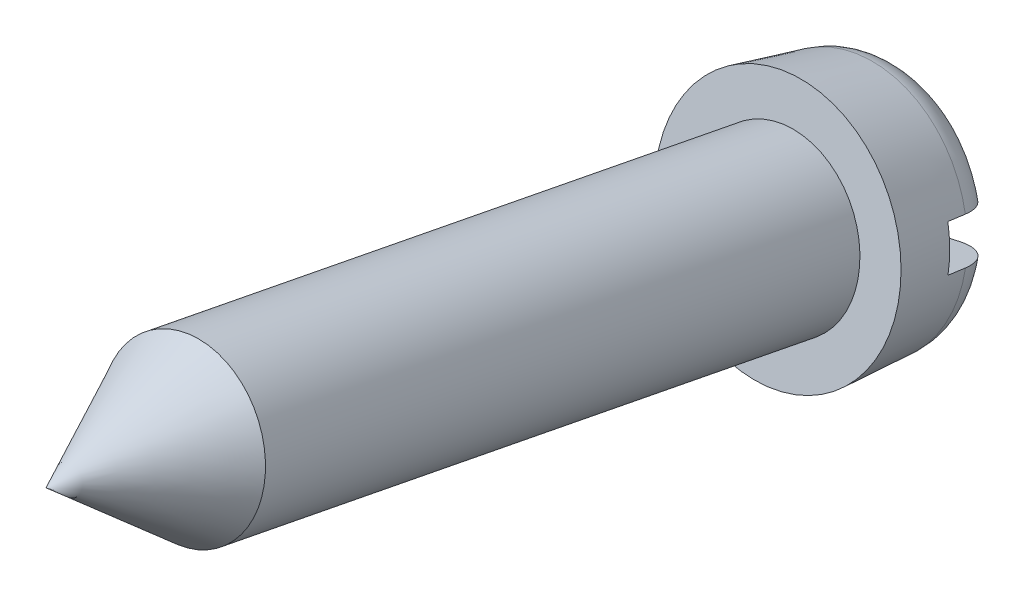
ISO-10303-21;
HEADER;
FILE_DESCRIPTION(('STEP AP214'),'2;1');
FILE_NAME('part.step','',(''),(''),'','','');
FILE_SCHEMA(('AUTOMOTIVE_DESIGN { 1 0 10303 214 1 1 1 1 }'));
ENDSEC;
DATA;
#1=APPLICATION_CONTEXT('core data for automotive mechanical design processes');
#2=APPLICATION_PROTOCOL_DEFINITION('international standard','automotive_design',2000,#1);
#3=PRODUCT_CONTEXT('',#1,'mechanical');
#4=PRODUCT('Part','Part','',(#3));
#5=PRODUCT_RELATED_PRODUCT_CATEGORY('part','',(#4));
#6=PRODUCT_DEFINITION_FORMATION('','',#4);
#7=PRODUCT_DEFINITION_CONTEXT('part definition',#1,'design');
#8=PRODUCT_DEFINITION('design','',#6,#7);
#9=PRODUCT_DEFINITION_SHAPE('','',#8);
#10=(LENGTH_UNIT() NAMED_UNIT(*) SI_UNIT(.MILLI.,.METRE.));
#11=(NAMED_UNIT(*) PLANE_ANGLE_UNIT() SI_UNIT($,.RADIAN.));
#12=(NAMED_UNIT(*) SI_UNIT($,.STERADIAN.) SOLID_ANGLE_UNIT());
#13=UNCERTAINTY_MEASURE_WITH_UNIT(LENGTH_MEASURE(1.E-05),#10,'distance_accuracy_value','');
#14=(GEOMETRIC_REPRESENTATION_CONTEXT(3) GLOBAL_UNCERTAINTY_ASSIGNED_CONTEXT((#13)) GLOBAL_UNIT_ASSIGNED_CONTEXT((#10,
#11,#12)) REPRESENTATION_CONTEXT('',''));
#15=CARTESIAN_POINT('',(0.,0.,0.));
#16=DIRECTION('',(0.,0.,1.));
#17=DIRECTION('',(1.,0.,0.));
#18=AXIS2_PLACEMENT_3D('',#15,#16,#17);
#19=CARTESIAN_POINT('',(-0.38161799075315,-15.0107993042347,-13.7981333496274));
#20=DIRECTION('',(0.,-0.190808995376531,-0.981627183447667));
#21=DIRECTION('',(0.,0.981627183447667,-0.190808995376531));
#22=AXIS2_PLACEMENT_3D('',#19,#20,#21);
#23=PLANE('',#22);
#24=CARTESIAN_POINT('',(0.,-16.9379831588022,-13.4235267562156));
#25=DIRECTION('',(0.,0.19080899537653,0.981627183447667));
#26=DIRECTION('',(0.,-0.981627183447667,0.19080899537653));
#27=AXIS2_PLACEMENT_3D('',#24,#25,#26);
#28=CIRCLE('',#27,2.99999999999838);
#29=CARTESIAN_POINT('',(0.,-19.8828647091437,-12.8510997700863));
#30=VERTEX_POINT('',#29);
#31=EDGE_CURVE('E362',#30,#30,#28,.F.);
#32=ORIENTED_EDGE('',*,*,#31,.F.);
#33=EDGE_LOOP('',(#32));
#34=FACE_BOUND('',#33,.T.);
#35=CARTESIAN_POINT('',(0.,-16.9379831588015,-13.4235267562115));
#36=DIRECTION('',(0.,-0.190808995376531,-0.981627183447667));
#37=DIRECTION('',(0.,0.981627183447667,-0.190808995376531));
#38=AXIS2_PLACEMENT_3D('',#35,#36,#37);
#39=CIRCLE('',#38,2.);
#40=CARTESIAN_POINT('',(0.,-14.9747287919061,-13.8051447469646));
#41=VERTEX_POINT('',#40);
#42=EDGE_CURVE('E368',#41,#41,#39,.F.);
#43=ORIENTED_EDGE('',*,*,#42,.F.);
#44=EDGE_LOOP('',(#43));
#45=FACE_BOUND('',#44,.T.);
#46=ADVANCED_FACE('F50',(#34,#45),#23,.F.);
#47=CARTESIAN_POINT('',(-0.306171576976402,-17.7539955935755,-14.6401775450695));
#48=DIRECTION('',(0.190808995376531,-0.963591927283399,0.187303296707943));
#49=DIRECTION('',(0.980952700432199,0.194246749045578,0.));
#50=AXIS2_PLACEMENT_3D('',#47,#48,#49);
#51=PLANE('',#50);
#52=CARTESIAN_POINT('',(2.38365123055152,-18.32642216919,-20.3252243839958));
#53=CARTESIAN_POINT('',(2.51154049356638,-18.0241711665487,-18.9005607018649));
#54=CARTESIAN_POINT('',(2.63899509345392,-17.7219955620035,-17.475842110728));
#55=CARTESIAN_POINT('',(2.79042943849088,-17.3621896799928,-15.7790700109387));
#56=CARTESIAN_POINT('',(2.81469562274593,-17.3045097003938,-15.5070526072748));
#57=CARTESIAN_POINT('',(2.85311913683512,-17.2131436953948,-15.0761579346152));
#58=CARTESIAN_POINT('',(2.86728297618997,-17.1794565403728,-14.9172814855761));
#59=CARTESIAN_POINT('',(2.88144363574417,-17.1457699371895,-14.7584046361844));
#60=B_SPLINE_CURVE_WITH_KNOTS('',3,(#52,#53,#54,#55,#56,#57,#58,#59),.UNSPECIFIED.,.F.,.F.,(4,2,
2,4),(0.,4.38593202307131,5.22329912253804,5.71237425293923),.UNSPECIFIED.);
#61=CARTESIAN_POINT('',(2.83895192718186,-17.2468314352771,-15.2350339591212));
#62=VERTEX_POINT('',#61);
#63=CARTESIAN_POINT('',(2.88144363574384,-17.1457699371902,-14.758404636188));
#64=VERTEX_POINT('',#63);
#65=EDGE_CURVE('E207',#62,#64,#60,.T.);
#66=ORIENTED_EDGE('',*,*,#65,.F.);
#67=CARTESIAN_POINT('',(2.83895192718186,-17.2468314352771,-15.2350339591212));
#68=CARTESIAN_POINT('',(2.83653356094295,-17.2525819121392,-15.2621539678937));
#69=CARTESIAN_POINT('',(2.8329621881366,-17.2585298886465,-15.2891154372193));
#70=CARTESIAN_POINT('',(2.82354285851075,-17.2707823160517,-15.3425530834871));
#71=CARTESIAN_POINT('',(2.81769507989926,-17.2770867390122,-15.3690292982473));
#72=CARTESIAN_POINT('',(2.79680855282106,-17.2964522256432,-15.4473786364315));
#73=CARTESIAN_POINT('',(2.77841660498609,-17.3099890117484,-15.4982831794404));
#74=CARTESIAN_POINT('',(2.73324661677561,-17.3379190539249,-15.5959553689845));
#75=CARTESIAN_POINT('',(2.70646574862995,-17.3523125974681,-15.6427216137384));
#76=CARTESIAN_POINT('',(2.64531664899881,-17.3815490022671,-15.7308362687842));
#77=CARTESIAN_POINT('',(2.61094926044076,-17.3963918134475,-15.7721852801645));
#78=CARTESIAN_POINT('',(2.53539284080362,-17.4262075178217,-15.8486031957463));
#79=CARTESIAN_POINT('',(2.49416128446664,-17.4411806329746,-15.8836299206384));
#80=CARTESIAN_POINT('',(2.40622084565148,-17.4707536944926,-15.9461837398524));
#81=CARTESIAN_POINT('',(2.35951017758502,-17.4853535173068,-15.973708379552));
#82=CARTESIAN_POINT('',(2.26110951386992,-17.5140309504917,-16.02099858469));
#83=CARTESIAN_POINT('',(2.20934739424114,-17.5280951687179,-16.0406217796147));
#84=CARTESIAN_POINT('',(2.10302016286996,-17.5550550438747,-16.0710009878965));
#85=CARTESIAN_POINT('',(2.04845720351463,-17.5679515776891,-16.0817637051022));
#86=CARTESIAN_POINT('',(1.96735436677044,-17.5858052185493,-16.0909919110895));
#87=CARTESIAN_POINT('',(1.94129464997065,-17.5913464976002,-16.0929518519147));
#88=CARTESIAN_POINT('',(1.88908299050371,-17.6020653974797,-16.0949069221665));
#89=CARTESIAN_POINT('',(1.86293134909708,-17.6072437451039,-16.0949060975313));
#90=CARTESIAN_POINT('',(1.83676947074281,-17.6122357586362,-16.0939362385456));
#91=B_SPLINE_CURVE_WITH_KNOTS('',3,(#67,#68,#69,#70,#71,#72,#73,#74,#75,#76,#77,#78,#79,#80,#81,
#82,#83,#84,#85,#86,#87,#88,#89,#90),.UNSPECIFIED.,.F.,.F.,(4,2,2,2,2,2,2,2,2,2,2,4),(0.,
0.0834330039714536,0.166859477718361,0.333375890255215,0.499948493309031,0.666502598026343,
0.834129813000788,1.00181180859714,1.1723927908766,1.3428445924502,1.42292459800113,
1.50283936274397),.UNSPECIFIED.);
#92=CARTESIAN_POINT('',(1.83676947074281,-17.6122357586362,-16.0939362385456));
#93=VERTEX_POINT('',#92);
#94=EDGE_CURVE('E325',#62,#93,#91,.T.);
#95=ORIENTED_EDGE('',*,*,#94,.T.);
#96=DIRECTION('',(0.981627183447667,0.187303296707943,-0.0364080727166026));
#97=VECTOR('',#96,1.);
#98=CARTESIAN_POINT('',(-1.64596047536363,-18.2767719608205,-15.9647634861318));
#99=LINE('',#98,#97);
#100=CARTESIAN_POINT('',(0.496980572352765,-17.8678795323546,-16.0442441227811));
#101=VERTEX_POINT('',#100);
#102=EDGE_CURVE('E373',#101,#93,#99,.T.);
#103=ORIENTED_EDGE('',*,*,#102,.F.);
#104=DIRECTION('',(0.,-0.190808995376531,-0.981627183447667));
#105=VECTOR('',#104,1.);
#106=CARTESIAN_POINT('',(0.496980572352765,-17.6007469388275,-14.6699660659543));
#107=LINE('',#106,#105);
#108=CARTESIAN_POINT('',(0.496980572352765,-17.6007469388275,-14.6699660659543));
#109=VERTEX_POINT('',#108);
#110=EDGE_CURVE('E445',#109,#101,#107,.T.);
#111=ORIENTED_EDGE('',*,*,#110,.F.);
#112=DIRECTION('',(-0.981627183447667,-0.187303296707942,0.0364080727166006));
#113=VECTOR('',#112,1.);
#114=CARTESIAN_POINT('',(-0.306171576976402,-17.7539955935755,-14.6401775450695));
#115=LINE('',#114,#113);
#116=EDGE_CURVE('E394',#64,#109,#115,.T.);
#117=ORIENTED_EDGE('',*,*,#116,.F.);
#118=EDGE_LOOP('',(#66,#95,#103,#111,#117));
#119=FACE_BOUND('',#118,.T.);
#120=ADVANCED_FACE('F172',(#119),#51,.F.);
#121=CARTESIAN_POINT('',(0.306171576976228,-16.6371550115441,-14.8572693626623));
#122=DIRECTION('',(-0.190808995376531,0.963591927283399,-0.187303296707943));
#123=DIRECTION('',(-0.980952700432199,-0.194246749045578,0.));
#124=AXIS2_PLACEMENT_3D('',#121,#122,#123);
#125=PLANE('',#124);
#126=CARTESIAN_POINT('',(-2.38365123055169,-18.2360663624492,-20.3427877736425));
#127=CARTESIAN_POINT('',(-2.51154049356655,-17.9826202033985,-18.908637390927));
#128=CARTESIAN_POINT('',(-2.6389950934541,-17.7290835671747,-17.4744643420917));
#129=CARTESIAN_POINT('',(-2.79042943849106,-17.427067755648,-15.7664589905366));
#130=CARTESIAN_POINT('',(-2.81469562274611,-17.3786481885276,-15.4926415450324));
#131=CARTESIAN_POINT('',(-2.8531191368353,-17.3019452877729,-15.0588966536369));
#132=CARTESIAN_POINT('',(-2.86728297619015,-17.2736633086669,-14.8989695448322));
#133=CARTESIAN_POINT('',(-2.88144363574434,-17.2453806679304,-14.7390422715495));
#134=B_SPLINE_CURVE_WITH_KNOTS('',3,(#126,#127,#128,#129,#130,#131,#132,#133),.UNSPECIFIED.,.F.,
.F.,(4,2,2,4),(0.,4.38593202307131,5.22329912253804,5.71237425293924),.UNSPECIFIED.);
#135=CARTESIAN_POINT('',(-2.83895192718204,-17.3302265655728,-15.2188235879138));
#136=VERTEX_POINT('',#135);
#137=CARTESIAN_POINT('',(-2.88144363574418,-17.2453806679308,-14.7390422715513));
#138=VERTEX_POINT('',#137);
#139=EDGE_CURVE('E372',#136,#138,#134,.T.);
#140=ORIENTED_EDGE('',*,*,#139,.F.);
#141=CARTESIAN_POINT('',(-2.83895192718204,-17.3302265655728,-15.2188235879138));
#142=CARTESIAN_POINT('',(-2.83653356094313,-17.3350541503699,-15.2461229887311));
#143=CARTESIAN_POINT('',(-2.83296218813678,-17.3396392267626,-15.2733493790024));
#144=CARTESIAN_POINT('',(-2.82354285851093,-17.3482970685217,-15.3274857419392));
#145=CARTESIAN_POINT('',(-2.81769507989944,-17.3523698739582,-15.3543957392037));
#146=CARTESIAN_POINT('',(-2.79680855282124,-17.3637646860917,-15.4342944195606));
#147=CARTESIAN_POINT('',(-2.77841660498627,-17.3702827740182,-15.4865632592914));
#148=CARTESIAN_POINT('',(-2.73324661677579,-17.3809751360514,-15.5875861144305));
#149=CARTESIAN_POINT('',(-2.70646574863013,-17.3851486185022,-15.6363389378189));
#150=CARTESIAN_POINT('',(-2.64531664899899,-17.3910494267637,-15.7289895733336));
#151=CARTESIAN_POINT('',(-2.61094926044094,-17.3927770241751,-15.7728879240207));
#152=CARTESIAN_POINT('',(-2.5353928408038,-17.3937590394989,-15.8549105409937));
#153=CARTESIAN_POINT('',(-2.49416128446682,-17.3929974509669,-15.8929957824523));
#154=CARTESIAN_POINT('',(-2.40622084565166,-17.3890108589183,-15.9620729375011));
#155=CARTESIAN_POINT('',(-2.35951017758521,-17.3857850504382,-15.9930625289223));
#156=CARTESIAN_POINT('',(-2.26110951387011,-17.3769110200474,-16.0476519991587));
#157=CARTESIAN_POINT('',(-2.20934739424132,-17.3712218821837,-16.0711148575467));
#158=CARTESIAN_POINT('',(-2.10302016287014,-17.3576053729423,-16.1093813159715));
#159=CARTESIAN_POINT('',(-2.04845720351481,-17.349679699838,-16.1241914601949));
#160=CARTESIAN_POINT('',(-1.96735436677062,-17.3365830390955,-16.1394357953757));
#161=CARTESIAN_POINT('',(-1.94129464997083,-17.3321794613817,-16.1433288205332));
#162=CARTESIAN_POINT('',(-1.88908299050389,-17.3229734526816,-16.1491569006742));
#163=CARTESIAN_POINT('',(-1.86293134909726,-17.3181718634573,-16.1510959792488));
#164=CARTESIAN_POINT('',(-1.83676947074299,-17.3131800335377,-16.1520667828396));
#165=B_SPLINE_CURVE_WITH_KNOTS('',3,(#141,#142,#143,#144,#145,#146,#147,#148,#149,#150,#151,
#152,#153,#154,#155,#156,#157,#158,#159,#160,#161,#162,#163,#164),.UNSPECIFIED.,.F.,.F.,(4,2,2,
2,2,2,2,2,2,2,2,4),(0.,0.0834330039714527,0.16685947771836,0.333375890255215,0.49994849330903,
0.666502598026341,0.834129813000784,1.00181180859714,1.1723927908766,1.3428445924502,
1.42292459800113,1.50283936274397),.UNSPECIFIED.);
#166=CARTESIAN_POINT('',(-1.83676947074299,-17.3131800335377,-16.1520667828396));
#167=VERTEX_POINT('',#166);
#168=EDGE_CURVE('E77',#136,#167,#165,.T.);
#169=ORIENTED_EDGE('',*,*,#168,.T.);
#170=DIRECTION('',(-0.981627183447666,-0.187303296707943,0.0364080727166027));
#171=VECTOR('',#170,1.);
#172=CARTESIAN_POINT('',(1.64596047536345,-16.6486438313533,-16.2812395352534));
#173=LINE('',#172,#171);
#174=CARTESIAN_POINT('',(-0.49698057235293,-17.0575362598192,-16.2017588986041));
#175=VERTEX_POINT('',#174);
#176=EDGE_CURVE('E369',#175,#167,#173,.T.);
#177=ORIENTED_EDGE('',*,*,#176,.F.);
#178=DIRECTION('',(0.,-0.190808995376531,-0.981627183447667));
#179=VECTOR('',#178,1.);
#180=CARTESIAN_POINT('',(-0.49698057235293,-16.7904036662921,-14.8274808417774));
#181=LINE('',#180,#179);
#182=CARTESIAN_POINT('',(-0.49698057235293,-16.7904036662921,-14.8274808417774));
#183=VERTEX_POINT('',#182);
#184=EDGE_CURVE('E408',#183,#175,#181,.T.);
#185=ORIENTED_EDGE('',*,*,#184,.F.);
#186=DIRECTION('',(0.981627183447667,0.187303296707943,-0.0364080727166028));
#187=VECTOR('',#186,1.);
#188=CARTESIAN_POINT('',(0.306171576976228,-16.6371550115441,-14.8572693626623));
#189=LINE('',#188,#187);
#190=EDGE_CURVE('E485',#138,#183,#189,.T.);
#191=ORIENTED_EDGE('',*,*,#190,.F.);
#192=EDGE_LOOP('',(#140,#169,#177,#185,#191));
#193=FACE_BOUND('',#192,.T.);
#194=ADVANCED_FACE('F178',(#193),#125,.F.);
#195=CARTESIAN_POINT('',(2.84947705265465,-16.1518694487942,-14.9515993203696));
#196=DIRECTION('',(0.,-0.190808995376531,-0.981627183447667));
#197=DIRECTION('',(0.,0.981627183447667,-0.190808995376531));
#198=AXIS2_PLACEMENT_3D('',#195,#196,#197);
#199=PLANE('',#198);
#200=CARTESIAN_POINT('',(0.,-17.1955753025607,-14.7487234538705));
#201=DIRECTION('',(0.,0.19080899537653,0.981627183447667));
#202=DIRECTION('',(0.,-0.981627183447667,0.19080899537653));
#203=AXIS2_PLACEMENT_3D('',#200,#201,#202);
#204=CIRCLE('',#203,2.88189030424129);
#205=CARTESIAN_POINT('',(2.69063464036752,-16.1821780099064,-14.9457079328936));
#206=VERTEX_POINT('',#205);
#207=EDGE_CURVE('E424',#206,#64,#204,.F.);
#208=ORIENTED_EDGE('',*,*,#207,.T.);
#209=ORIENTED_EDGE('',*,*,#116,.T.);
#210=DIRECTION('',(0.190808995376523,-0.9635919272834,0.187303296707946));
#211=VECTOR('',#210,1.);
#212=CARTESIAN_POINT('',(0.496980572352765,-17.6007469388275,-14.6699660659543));
#213=LINE('',#212,#211);
#214=CARTESIAN_POINT('',(0.623654078814082,-18.2404524620705,-14.5456199085893));
#215=VERTEX_POINT('',#214);
#216=EDGE_CURVE('E695',#109,#215,#213,.T.);
#217=ORIENTED_EDGE('',*,*,#216,.T.);
#218=DIRECTION('',(-0.981627183447668,-0.187303296707938,0.0364080727165954));
#219=VECTOR('',#218,1.);
#220=CARTESIAN_POINT('',(0.623654078814082,-18.2404524620705,-14.5456199085893));
#221=LINE('',#220,#219);
#222=CARTESIAN_POINT('',(-0.179498070515077,-18.3937011168185,-14.5158313877044));
#223=VERTEX_POINT('',#222);
#224=EDGE_CURVE('E696',#215,#223,#221,.T.);
#225=ORIENTED_EDGE('',*,*,#224,.T.);
#226=DIRECTION('',(-0.190808995376522,0.963591927283401,-0.18730329670794));
#227=VECTOR('',#226,1.);
#228=CARTESIAN_POINT('',(-0.179498070515077,-18.3937011168185,-14.5158313877044));
#229=LINE('',#228,#227);
#230=CARTESIAN_POINT('',(-0.306171576976393,-17.7539955935755,-14.6401775450695));
#231=VERTEX_POINT('',#230);
#232=EDGE_CURVE('E435',#223,#231,#229,.T.);
#233=ORIENTED_EDGE('',*,*,#232,.T.);
#234=CARTESIAN_POINT('',(-2.69063464036765,-18.2089725952142,-14.5517389748434));
#235=VERTEX_POINT('',#234);
#236=EDGE_CURVE('E307',#231,#235,#115,.T.);
#237=ORIENTED_EDGE('',*,*,#236,.T.);
#238=EDGE_CURVE('E416',#235,#138,#204,.F.);
#239=ORIENTED_EDGE('',*,*,#238,.T.);
#240=ORIENTED_EDGE('',*,*,#190,.T.);
#241=DIRECTION('',(0.190808995376531,-0.963591927283399,0.187303296707943));
#242=VECTOR('',#241,1.);
#243=CARTESIAN_POINT('',(-0.623654078814252,-16.1506981430491,-14.9518269991425));
#244=LINE('',#243,#242);
#245=CARTESIAN_POINT('',(-0.623654078814252,-16.1506981430491,-14.9518269991425));
#246=VERTEX_POINT('',#245);
#247=EDGE_CURVE('E402',#246,#183,#244,.T.);
#248=ORIENTED_EDGE('',*,*,#247,.F.);
#249=DIRECTION('',(-0.981627183447667,-0.187303296707942,0.0364080727165996));
#250=VECTOR('',#249,1.);
#251=CARTESIAN_POINT('',(0.179498070514904,-15.9974494883011,-14.9816155200273));
#252=LINE('',#251,#250);
#253=CARTESIAN_POINT('',(0.179498070514904,-15.9974494883011,-14.9816155200273));
#254=VERTEX_POINT('',#253);
#255=EDGE_CURVE('E467',#254,#246,#252,.T.);
#256=ORIENTED_EDGE('',*,*,#255,.F.);
#257=DIRECTION('',(0.190808995376531,-0.963591927283399,0.187303296707943));
#258=VECTOR('',#257,1.);
#259=CARTESIAN_POINT('',(0.179498070514904,-15.9974494883011,-14.9816155200273));
#260=LINE('',#259,#258);
#261=CARTESIAN_POINT('',(0.306171576976227,-16.6371550115441,-14.8572693626623));
#262=VERTEX_POINT('',#261);
#263=EDGE_CURVE('E405',#254,#262,#260,.T.);
#264=ORIENTED_EDGE('',*,*,#263,.T.);
#265=EDGE_CURVE('E483',#262,#206,#189,.T.);
#266=ORIENTED_EDGE('',*,*,#265,.T.);
#267=EDGE_LOOP('',(#208,#209,#217,#225,#233,#237,#239,#240,#248,#256,#264,#266));
#268=FACE_BOUND('',#267,.T.);
#269=ADVANCED_FACE('F192',(#268),#199,.T.);
#270=CARTESIAN_POINT('',(0.,-16.9379831588049,-13.423526756229));
#271=DIRECTION('',(0.,0.19080899537653,0.981627183447667));
#272=DIRECTION('',(0.,-0.981627183447667,0.19080899537653));
#273=AXIS2_PLACEMENT_3D('',#270,#271,#272);
#274=CONICAL_SURFACE('',#273,2.99999999999718,0.0872664625975362);
#275=CARTESIAN_POINT('',(-2.69063464036781,-18.2089725952138,-14.5517389748416));
#276=CARTESIAN_POINT('',(-2.67647393490942,-18.2372552263539,-14.7116662455182));
#277=CARTESIAN_POINT('',(-2.66231009948414,-18.2655372062827,-14.8715933545526));
#278=CARTESIAN_POINT('',(-2.57249059449448,-18.4448398882392,-15.885526316352));
#279=CARTESIAN_POINT('',(-2.49674323682555,-18.5958415123657,-16.7395274260264));
#280=CARTESIAN_POINT('',(-2.34499687291621,-18.8977923895074,-18.4475165779647));
#281=CARTESIAN_POINT('',(-2.26899786666589,-19.0487416425205,-19.301504620228));
#282=CARTESIAN_POINT('',(-2.19284223517516,-19.1996582897326,-20.1554844769345));
#283=B_SPLINE_CURVE_WITH_KNOTS('',3,(#275,#276,#277,#278,#279,#280,#281,#282),.UNSPECIFIED.,.F.,
.F.,(4,2,2,4),(0.,0.489075130401186,3.10072465516532,5.71237428273171),.UNSPECIFIED.);
#284=CARTESIAN_POINT('',(-2.6481429318055,-18.2938184928562,-15.0315202912058));
#285=VERTEX_POINT('',#284);
#286=EDGE_CURVE('E215',#235,#285,#283,.T.);
#287=ORIENTED_EDGE('',*,*,#286,.T.);
#288=CARTESIAN_POINT('',(0.,-17.2885290004249,-15.2269287735175));
#289=DIRECTION('',(0.,-0.190808995376531,-0.981627183447667));
#290=DIRECTION('',(0.,0.981627183447667,-0.190808995376531));
#291=AXIS2_PLACEMENT_3D('',#288,#289,#290);
#292=CIRCLE('',#291,2.839269699381);
#293=EDGE_CURVE('E332',#285,#62,#292,.F.);
#294=ORIENTED_EDGE('',*,*,#293,.T.);
#295=ORIENTED_EDGE('',*,*,#65,.T.);
#296=ORIENTED_EDGE('',*,*,#207,.F.);
#297=CARTESIAN_POINT('',(2.69063464036764,-16.1821780099061,-14.9457079328923));
#298=CARTESIAN_POINT('',(2.67647393490925,-16.2158646210109,-15.1045847762728));
#299=CARTESIAN_POINT('',(2.66231009948397,-16.249551775356,-15.2634612258332));
#300=CARTESIAN_POINT('',(2.57249059449427,-16.4631311963372,-16.2707314645051));
#301=CARTESIAN_POINT('',(2.49674323682533,-16.6430393749022,-17.1191137091919));
#302=CARTESIAN_POINT('',(2.34499687291594,-17.0028993945432,-18.8158464641098));
#303=CARTESIAN_POINT('',(2.26899786666561,-17.1828512356208,-19.6641969743396));
#304=CARTESIAN_POINT('',(2.19284223517485,-17.362830241907,-20.5125276807053));
#305=B_SPLINE_CURVE_WITH_KNOTS('',3,(#297,#298,#299,#300,#301,#302,#303,#304),.UNSPECIFIED.,.F.,
.F.,(4,2,2,4),(0.,0.489075130401216,3.10072465516615,5.71237428273335),.UNSPECIFIED.);
#306=CARTESIAN_POINT('',(2.64814293180533,-16.2832395079937,-15.4223372558292));
#307=VERTEX_POINT('',#306);
#308=EDGE_CURVE('E355',#206,#307,#305,.T.);
#309=ORIENTED_EDGE('',*,*,#308,.T.);
#310=CARTESIAN_POINT('',(0.,-17.2885290004249,-15.2269287735175));
#311=DIRECTION('',(0.,-0.190808995376531,-0.981627183447667));
#312=DIRECTION('',(0.,0.981627183447667,-0.190808995376531));
#313=AXIS2_PLACEMENT_3D('',#310,#311,#312);
#314=CIRCLE('',#313,2.839269699381);
#315=EDGE_CURVE('E378',#307,#136,#314,.F.);
#316=ORIENTED_EDGE('',*,*,#315,.T.);
#317=ORIENTED_EDGE('',*,*,#139,.T.);
#318=ORIENTED_EDGE('',*,*,#238,.F.);
#319=EDGE_LOOP('',(#287,#294,#295,#296,#309,#316,#317,#318));
#320=FACE_BOUND('',#319,.T.);
#321=ORIENTED_EDGE('',*,*,#31,.T.);
#322=EDGE_LOOP('',(#321));
#323=FACE_BOUND('',#322,.T.);
#324=ADVANCED_FACE('F187',(#320,#323),#274,.T.);
#325=CARTESIAN_POINT('',(0.,-17.4627078960869,-16.1230015106926));
#326=DIRECTION('',(0.,-0.190808995376531,-0.981627183447667));
#327=DIRECTION('',(0.,0.981627183447667,-0.190808995376531));
#328=AXIS2_PLACEMENT_3D('',#325,#326,#327);
#329=PLANE('',#328);
#330=ORIENTED_EDGE('',*,*,#176,.T.);
#331=CARTESIAN_POINT('',(0.,-17.4627078960869,-16.1230015106926));
#332=DIRECTION('',(0.,-0.190808995376531,-0.981627183447667));
#333=DIRECTION('',(0.,0.981627183447667,-0.190808995376531));
#334=AXIS2_PLACEMENT_3D('',#331,#332,#333);
#335=CIRCLE('',#334,1.84307500128906);
#336=CARTESIAN_POINT('',(1.64596047536628,-16.6486438313528,-16.2812395352535));
#337=VERTEX_POINT('',#336);
#338=EDGE_CURVE('E63',#167,#337,#335,.T.);
#339=ORIENTED_EDGE('',*,*,#338,.T.);
#340=CARTESIAN_POINT('',(0.306171576976227,-16.9042876050712,-16.231547419489));
#341=VERTEX_POINT('',#340);
#342=EDGE_CURVE('E346',#337,#341,#173,.T.);
#343=ORIENTED_EDGE('',*,*,#342,.T.);
#344=DIRECTION('',(0.190808995376531,-0.963591927283399,0.187303296707943));
#345=VECTOR('',#344,1.);
#346=CARTESIAN_POINT('',(0.179498070514905,-16.2645820818282,-16.3558935768541));
#347=LINE('',#346,#345);
#348=CARTESIAN_POINT('',(0.179498070514905,-16.2645820818282,-16.3558935768541));
#349=VERTEX_POINT('',#348);
#350=EDGE_CURVE('E412',#349,#341,#347,.T.);
#351=ORIENTED_EDGE('',*,*,#350,.F.);
#352=DIRECTION('',(0.981627183447667,0.187303296707942,-0.0364080727166038));
#353=VECTOR('',#352,1.);
#354=CARTESIAN_POINT('',(-0.623654078814252,-16.4178307365762,-16.3261050559692));
#355=LINE('',#354,#353);
#356=CARTESIAN_POINT('',(-0.623654078814252,-16.4178307365762,-16.3261050559692));
#357=VERTEX_POINT('',#356);
#358=EDGE_CURVE('E461',#357,#349,#355,.T.);
#359=ORIENTED_EDGE('',*,*,#358,.F.);
#360=DIRECTION('',(0.190808995376531,-0.963591927283399,0.187303296707943));
#361=VECTOR('',#360,1.);
#362=CARTESIAN_POINT('',(-0.623654078814252,-16.4178307365762,-16.3261050559692));
#363=LINE('',#362,#361);
#364=EDGE_CURVE('E396',#357,#175,#363,.T.);
#365=ORIENTED_EDGE('',*,*,#364,.T.);
#366=EDGE_LOOP('',(#330,#339,#343,#351,#359,#365));
#367=FACE_BOUND('',#366,.T.);
#368=ADVANCED_FACE('F191',(#367),#329,.T.);
#369=ORIENTED_EDGE('',*,*,#342,.F.);
#370=CARTESIAN_POINT('',(1.64596047536628,-16.6486438313528,-16.2812395352535));
#371=CARTESIAN_POINT('',(1.67496391385831,-16.6431096850582,-16.2823151077118));
#372=CARTESIAN_POINT('',(1.70395534259786,-16.637346248928,-16.2821988516901));
#373=CARTESIAN_POINT('',(1.76174365594348,-16.6253906377916,-16.2795624839832));
#374=CARTESIAN_POINT('',(1.7905405127658,-16.6191984029184,-16.2770420360058));
#375=CARTESIAN_POINT('',(1.87634962199868,-16.6000305109043,-16.2658469523216));
#376=CARTESIAN_POINT('',(1.93280251408765,-16.5864594531742,-16.2535394164244));
#377=CARTESIAN_POINT('',(2.04249453075154,-16.5581006696657,-16.2193912115166));
#378=CARTESIAN_POINT('',(2.09572901678209,-16.5433112571485,-16.1975371396243));
#379=CARTESIAN_POINT('',(2.1972555643546,-16.5129590300967,-16.1448152570443));
#380=CARTESIAN_POINT('',(2.24555124326469,-16.4973967942,-16.1139541082648));
#381=CARTESIAN_POINT('',(2.33447242119084,-16.4663846096353,-16.0449957381066));
#382=CARTESIAN_POINT('',(2.37526958950736,-16.4509429427688,-16.0071160052863));
#383=CARTESIAN_POINT('',(2.44951276004332,-16.4202084939313,-15.9246337304023));
#384=CARTESIAN_POINT('',(2.48295553538855,-16.4049157801176,-15.8800282517063));
#385=CARTESIAN_POINT('',(2.54077667724319,-16.3752728337738,-15.7864318755772));
#386=CARTESIAN_POINT('',(2.56533335471003,-16.3609094489021,-15.7375549635607));
#387=CARTESIAN_POINT('',(2.60558540205975,-16.3332104820387,-15.6360615649866));
#388=CARTESIAN_POINT('',(2.62129540932469,-16.3198732340009,-15.5834514187102));
#389=CARTESIAN_POINT('',(2.63600172707662,-16.3030859586081,-15.5120699450863));
#390=CARTESIAN_POINT('',(2.63914530574609,-16.2989961645799,-15.4942321948664));
#391=CARTESIAN_POINT('',(2.64440899742294,-16.2909886364609,-15.4583992445121));
#392=CARTESIAN_POINT('',(2.64653077307377,-16.2870706323483,-15.4404043489988));
#393=CARTESIAN_POINT('',(2.64814293180534,-16.2832395079937,-15.4223372558291));
#394=B_SPLINE_CURVE_WITH_KNOTS('',3,(#370,#371,#372,#373,#374,#375,#376,#377,#378,#379,#380,
#381,#382,#383,#384,#385,#386,#387,#388,#389,#390,#391,#392,#393),.UNSPECIFIED.,.F.,.F.,(4,2,2,
2,2,2,2,2,2,2,2,4),(0.,0.0885883998161771,0.177189192969709,0.354324076872299,0.531708453026731,
0.708961961353032,0.881437255332222,1.05398807566973,1.22285426266529,1.39144022257563,
1.44712469884955,1.50271825847926),.UNSPECIFIED.);
#395=EDGE_CURVE('E13',#337,#307,#394,.T.);
#396=ORIENTED_EDGE('',*,*,#395,.T.);
#397=ORIENTED_EDGE('',*,*,#308,.F.);
#398=ORIENTED_EDGE('',*,*,#265,.F.);
#399=DIRECTION('',(0.,0.190808995376531,0.981627183447667));
#400=VECTOR('',#399,1.);
#401=CARTESIAN_POINT('',(0.306171576976228,-16.9042876050712,-16.231547419489));
#402=LINE('',#401,#400);
#403=EDGE_CURVE('E447',#341,#262,#402,.T.);
#404=ORIENTED_EDGE('',*,*,#403,.F.);
#405=EDGE_LOOP('',(#369,#396,#397,#398,#404));
#406=FACE_BOUND('',#405,.T.);
#407=ADVANCED_FACE('F315',(#406),#125,.F.);
#408=CARTESIAN_POINT('',(-1.64596047536646,-18.2767719608211,-15.9647634861317));
#409=VERTEX_POINT('',#408);
#410=CARTESIAN_POINT('',(-0.306171576976393,-18.0211281871026,-16.0144556018962));
#411=VERTEX_POINT('',#410);
#412=EDGE_CURVE('E308',#409,#411,#99,.T.);
#413=ORIENTED_EDGE('',*,*,#412,.F.);
#414=CARTESIAN_POINT('',(-1.64596047536646,-18.276771960821,-15.9647634861317));
#415=CARTESIAN_POINT('',(-1.67496391385849,-18.2823060484487,-15.9636876118585));
#416=CARTESIAN_POINT('',(-1.70395534259804,-18.2876062631032,-15.9614207999771));
#417=CARTESIAN_POINT('',(-1.76174365594366,-18.2977037119947,-15.9544977516446));
#418=CARTESIAN_POINT('',(-1.79054051276598,-18.3025008757621,-15.9498411809622));
#419=CARTESIAN_POINT('',(-1.87634962199886,-18.3160792836018,-15.9322808613893));
#420=CARTESIAN_POINT('',(-1.93280251408783,-18.3240516651228,-15.9157857051106));
#421=CARTESIAN_POINT('',(-2.04249453075172,-18.3375533286152,-15.8735006535741));
#422=CARTESIAN_POINT('',(-2.09572901678227,-18.3430791536958,-15.8476976995173));
#423=CARTESIAN_POINT('',(-2.19725556435477,-18.3514712837367,-15.7874446768283));
#424=CARTESIAN_POINT('',(-2.24555124326487,-18.3543395477878,-15.7530010017714));
#425=CARTESIAN_POINT('',(-2.33447242119102,-18.3572612844786,-15.6774465455093));
#426=CARTESIAN_POINT('',(-2.37526958950754,-18.3573885510135,-15.6365405186015));
#427=CARTESIAN_POINT('',(-2.4495127600435,-18.3549866317431,-15.5485509578615));
#428=CARTESIAN_POINT('',(-2.48295553538873,-18.3524562826618,-15.5014647267636));
#429=CARTESIAN_POINT('',(-2.54077667724336,-18.3448789242956,-15.4035792348221));
#430=CARTESIAN_POINT('',(-2.5653333547102,-18.3398868093384,-15.3528807324626));
#431=CARTESIAN_POINT('',(-2.60558540205993,-18.3275487479083,-15.2484014763417));
#432=CARTESIAN_POINT('',(-2.62129540932487,-18.3202067212776,-15.1946259770749));
#433=CARTESIAN_POINT('',(-2.6360017270768,-18.3090316413167,-15.1221536031679));
#434=CARTESIAN_POINT('',(-2.63914530574627,-18.3061414934641,-15.1040826653536));
#435=CARTESIAN_POINT('',(-2.64440899742312,-18.3001426847868,-15.0678592594933));
#436=CARTESIAN_POINT('',(-2.64653077307395,-18.2970343884349,-15.0497069727351));
#437=CARTESIAN_POINT('',(-2.64814293180551,-18.2938184928562,-15.0315202912058));
#438=B_SPLINE_CURVE_WITH_KNOTS('',3,(#414,#415,#416,#417,#418,#419,#420,#421,#422,#423,#424,
#425,#426,#427,#428,#429,#430,#431,#432,#433,#434,#435,#436,#437),.UNSPECIFIED.,.F.,.F.,(4,2,2,
2,2,2,2,2,2,2,2,4),(0.,0.0885883998161771,0.177189192969709,0.354324076872299,0.53170845302673,
0.708961961353032,0.881437255332222,1.05398807566973,1.22285426266528,1.39144022257563,
1.44712469884955,1.50271825847926),.UNSPECIFIED.);
#439=EDGE_CURVE('E337',#409,#285,#438,.T.);
#440=ORIENTED_EDGE('',*,*,#439,.T.);
#441=ORIENTED_EDGE('',*,*,#286,.F.);
#442=ORIENTED_EDGE('',*,*,#236,.F.);
#443=DIRECTION('',(0.,-0.190808995376531,-0.981627183447667));
#444=VECTOR('',#443,1.);
#445=CARTESIAN_POINT('',(-0.306171576976393,-17.7539955935755,-14.6401775450695));
#446=LINE('',#445,#444);
#447=EDGE_CURVE('E448',#231,#411,#446,.T.);
#448=ORIENTED_EDGE('',*,*,#447,.T.);
#449=EDGE_LOOP('',(#413,#440,#441,#442,#448));
#450=FACE_BOUND('',#449,.T.);
#451=ADVANCED_FACE('F181',(#450),#51,.F.);
#452=CARTESIAN_POINT('',(0.,-17.4627078960869,-16.1230015106926));
#453=DIRECTION('',(0.,-0.190808995376531,-0.981627183447667));
#454=DIRECTION('',(0.,0.981627183447667,-0.190808995376531));
#455=AXIS2_PLACEMENT_3D('',#452,#453,#454);
#456=PLANE('',#455);
#457=ORIENTED_EDGE('',*,*,#102,.T.);
#458=CARTESIAN_POINT('',(0.,-17.4627078960869,-16.1230015106926));
#459=DIRECTION('',(0.,-0.190808995376531,-0.981627183447667));
#460=DIRECTION('',(0.,0.981627183447667,-0.190808995376531));
#461=AXIS2_PLACEMENT_3D('',#458,#459,#460);
#462=CIRCLE('',#461,1.84307500128906);
#463=EDGE_CURVE('E331',#93,#409,#462,.T.);
#464=ORIENTED_EDGE('',*,*,#463,.T.);
#465=ORIENTED_EDGE('',*,*,#412,.T.);
#466=DIRECTION('',(-0.190808995376522,0.963591927283401,-0.18730329670794));
#467=VECTOR('',#466,1.);
#468=CARTESIAN_POINT('',(-0.179498070515077,-18.6608337103456,-15.8901094445311));
#469=LINE('',#468,#467);
#470=CARTESIAN_POINT('',(-0.179498070515077,-18.6608337103456,-15.8901094445311));
#471=VERTEX_POINT('',#470);
#472=EDGE_CURVE('E454',#471,#411,#469,.T.);
#473=ORIENTED_EDGE('',*,*,#472,.F.);
#474=DIRECTION('',(-0.981627183447668,-0.187303296707938,0.0364080727165954));
#475=VECTOR('',#474,1.);
#476=CARTESIAN_POINT('',(0.623654078814082,-18.5075850555976,-15.919897965416));
#477=LINE('',#476,#475);
#478=CARTESIAN_POINT('',(0.623654078814082,-18.5075850555976,-15.919897965416));
#479=VERTEX_POINT('',#478);
#480=EDGE_CURVE('E693',#479,#471,#477,.T.);
#481=ORIENTED_EDGE('',*,*,#480,.F.);
#482=DIRECTION('',(0.190808995376523,-0.9635919272834,0.187303296707946));
#483=VECTOR('',#482,1.);
#484=CARTESIAN_POINT('',(0.496980572352765,-17.8678795323546,-16.0442441227811));
#485=LINE('',#484,#483);
#486=EDGE_CURVE('E444',#101,#479,#485,.T.);
#487=ORIENTED_EDGE('',*,*,#486,.F.);
#488=EDGE_LOOP('',(#457,#464,#465,#473,#481,#487));
#489=FACE_BOUND('',#488,.T.);
#490=ADVANCED_FACE('F314',(#489),#456,.T.);
#491=CARTESIAN_POINT('',(-0.623654078814252,-16.1506981430491,-14.9518269991425));
#492=DIRECTION('',(-0.981627183447667,-0.187303296707943,0.036408072716601));
#493=DIRECTION('',(0.187427559991883,-0.982278427817434,0.));
#494=AXIS2_PLACEMENT_3D('',#491,#492,#493);
#495=PLANE('',#494);
#496=ORIENTED_EDGE('',*,*,#184,.T.);
#497=ORIENTED_EDGE('',*,*,#364,.F.);
#498=DIRECTION('',(0.,-0.190808995376531,-0.981627183447667));
#499=VECTOR('',#498,1.);
#500=CARTESIAN_POINT('',(-0.623654078814252,-16.1506981430491,-14.9518269991425));
#501=LINE('',#500,#499);
#502=EDGE_CURVE('E414',#246,#357,#501,.T.);
#503=ORIENTED_EDGE('',*,*,#502,.F.);
#504=ORIENTED_EDGE('',*,*,#247,.T.);
#505=EDGE_LOOP('',(#496,#497,#503,#504));
#506=FACE_BOUND('',#505,.T.);
#507=ADVANCED_FACE('F317',(#506),#495,.F.);
#508=CARTESIAN_POINT('',(0.179498070514905,-16.2645820818282,-16.3558935768541));
#509=DIRECTION('',(0.981627183447667,0.187303296707943,-0.0364080727166003));
#510=DIRECTION('',(-0.187427559991883,0.982278427817434,0.));
#511=AXIS2_PLACEMENT_3D('',#508,#509,#510);
#512=PLANE('',#511);
#513=ORIENTED_EDGE('',*,*,#403,.T.);
#514=ORIENTED_EDGE('',*,*,#263,.F.);
#515=DIRECTION('',(0.,0.190808995376531,0.981627183447667));
#516=VECTOR('',#515,1.);
#517=CARTESIAN_POINT('',(0.179498070514905,-16.2645820818282,-16.3558935768541));
#518=LINE('',#517,#516);
#519=EDGE_CURVE('E464',#349,#254,#518,.T.);
#520=ORIENTED_EDGE('',*,*,#519,.F.);
#521=ORIENTED_EDGE('',*,*,#350,.T.);
#522=EDGE_LOOP('',(#513,#514,#520,#521));
#523=FACE_BOUND('',#522,.T.);
#524=ADVANCED_FACE('F479',(#523),#512,.F.);
#525=CARTESIAN_POINT('',(2.41242809579386,-12.1828440722693,2.36810499694415));
#526=DIRECTION('',(0.19080899537653,-0.963591927283399,0.187303296707943));
#527=DIRECTION('',(0.9809527004322,0.194246749045577,0.));
#528=AXIS2_PLACEMENT_3D('',#525,#526,#527);
#529=PLANE('',#528);
#530=ORIENTED_EDGE('',*,*,#358,.T.);
#531=ORIENTED_EDGE('',*,*,#519,.T.);
#532=ORIENTED_EDGE('',*,*,#255,.T.);
#533=ORIENTED_EDGE('',*,*,#502,.T.);
#534=EDGE_LOOP('',(#530,#531,#532,#533));
#535=FACE_BOUND('',#534,.T.);
#536=ADVANCED_FACE('F473',(#535),#529,.T.);
#537=CARTESIAN_POINT('',(0.496980572352765,-17.6007469388275,-14.6699660659543));
#538=DIRECTION('',(0.981627183447668,0.187303296707935,-0.0364080727165994));
#539=DIRECTION('',(-0.187427559991875,0.982278427817435,0.));
#540=AXIS2_PLACEMENT_3D('',#537,#538,#539);
#541=PLANE('',#540);
#542=ORIENTED_EDGE('',*,*,#486,.T.);
#543=DIRECTION('',(0.,-0.190808995376531,-0.981627183447667));
#544=VECTOR('',#543,1.);
#545=CARTESIAN_POINT('',(0.623654078814082,-18.2404524620705,-14.5456199085893));
#546=LINE('',#545,#544);
#547=EDGE_CURVE('E458',#215,#479,#546,.T.);
#548=ORIENTED_EDGE('',*,*,#547,.F.);
#549=ORIENTED_EDGE('',*,*,#216,.F.);
#550=ORIENTED_EDGE('',*,*,#110,.T.);
#551=EDGE_LOOP('',(#542,#548,#549,#550));
#552=FACE_BOUND('',#551,.T.);
#553=ADVANCED_FACE('F649',(#552),#541,.F.);
#554=CARTESIAN_POINT('',(-0.179498070515077,-18.3937011168185,-14.5158313877044));
#555=DIRECTION('',(-0.981627183447669,-0.187303296707934,0.0364080727165992));
#556=DIRECTION('',(0.187427559991874,-0.982278427817435,0.));
#557=AXIS2_PLACEMENT_3D('',#554,#555,#556);
#558=PLANE('',#557);
#559=ORIENTED_EDGE('',*,*,#472,.T.);
#560=ORIENTED_EDGE('',*,*,#447,.F.);
#561=ORIENTED_EDGE('',*,*,#232,.F.);
#562=DIRECTION('',(0.,-0.190808995376531,-0.981627183447667));
#563=VECTOR('',#562,1.);
#564=CARTESIAN_POINT('',(-0.179498070515077,-18.3937011168185,-14.5158313877044));
#565=LINE('',#564,#563);
#566=EDGE_CURVE('E451',#223,#471,#565,.T.);
#567=ORIENTED_EDGE('',*,*,#566,.T.);
#568=EDGE_LOOP('',(#559,#560,#561,#567));
#569=FACE_BOUND('',#568,.T.);
#570=ADVANCED_FACE('F652',(#569),#558,.F.);
#571=CARTESIAN_POINT('',(0.623654078814082,-18.2404524620705,-14.5456199085893));
#572=DIRECTION('',(0.190808995376525,-0.9635919272834,0.187303296707943));
#573=DIRECTION('',(0.980952700432201,0.194246749045571,0.));
#574=AXIS2_PLACEMENT_3D('',#571,#572,#573);
#575=PLANE('',#574);
#576=ORIENTED_EDGE('',*,*,#480,.T.);
#577=ORIENTED_EDGE('',*,*,#566,.F.);
#578=ORIENTED_EDGE('',*,*,#224,.F.);
#579=ORIENTED_EDGE('',*,*,#547,.T.);
#580=EDGE_LOOP('',(#576,#577,#578,#579));
#581=FACE_BOUND('',#580,.T.);
#582=ADVANCED_FACE('F167',(#581),#575,.F.);
#583=CARTESIAN_POINT('',(0.,-14.0758482281535,1.30088099550348));
#584=DIRECTION('',(0.,-0.190808995376531,-0.981627183447667));
#585=DIRECTION('',(0.,0.981627183447667,-0.190808995376531));
#586=AXIS2_PLACEMENT_3D('',#583,#584,#585);
#587=CYLINDRICAL_SURFACE('',#586,2.);
#588=CARTESIAN_POINT('',(0.,-14.0758482281535,1.30088099550348));
#589=DIRECTION('',(0.,0.190808995376531,0.981627183447667));
#590=DIRECTION('',(0.,-0.981627183447667,0.190808995376531));
#591=AXIS2_PLACEMENT_3D('',#588,#589,#590);
#592=CIRCLE('',#591,2.);
#593=CARTESIAN_POINT('',(0.,-16.0391025950488,1.68249898625654));
#594=VERTEX_POINT('',#593);
#595=EDGE_CURVE('E700',#594,#594,#592,.T.);
#596=ORIENTED_EDGE('',*,*,#595,.F.);
#597=EDGE_LOOP('',(#596));
#598=FACE_BOUND('',#597,.T.);
#599=ORIENTED_EDGE('',*,*,#42,.T.);
#600=EDGE_LOOP('',(#599));
#601=FACE_BOUND('',#600,.T.);
#602=ADVANCED_FACE('F159',(#598,#601),#587,.T.);
#603=CARTESIAN_POINT('',(3.63079305796724E-11,-13.4148664790907,4.70133730712771));
#604=DIRECTION('',(0.,-0.190808995376531,-0.981627183447667));
#605=DIRECTION('',(0.,0.981627183447667,-0.190808995376531));
#606=AXIS2_PLACEMENT_3D('',#603,#604,#605);
#607=CONICAL_SURFACE('',#606,0.,0.523598775598299);
#608=ORIENTED_EDGE('',*,*,#595,.T.);
#609=EDGE_LOOP('',(#608));
#610=FACE_BOUND('',#609,.T.);
#611=CARTESIAN_POINT('',(3.63079305796724E-11,-13.4148664790907,4.70133730712771));
#612=VERTEX_POINT('',#611);
#613=VERTEX_LOOP('',#612);
#614=FACE_BOUND('',#613,.T.);
#615=ADVANCED_FACE('F156',(#610,#614),#607,.T.);
#616=CARTESIAN_POINT('',(0.,-17.2718989007104,-15.1413743272449));
#617=DIRECTION('',(0.,-0.190808995376531,-0.981627183447667));
#618=DIRECTION('',(0.,0.981627183447667,-0.190808995376531));
#619=AXIS2_PLACEMENT_3D('',#616,#617,#618);
#620=TOROIDAL_SURFACE('',#619,1.84307500128906,0.999999999999999);
#621=ORIENTED_EDGE('',*,*,#439,.F.);
#622=ORIENTED_EDGE('',*,*,#463,.F.);
#623=ORIENTED_EDGE('',*,*,#94,.F.);
#624=ORIENTED_EDGE('',*,*,#293,.F.);
#625=EDGE_LOOP('',(#621,#622,#623,#624));
#626=FACE_BOUND('',#625,.T.);
#627=ADVANCED_FACE('F158',(#626),#620,.T.);
#628=CARTESIAN_POINT('',(0.,-17.2718989007104,-15.1413743272449));
#629=DIRECTION('',(0.,-0.190808995376531,-0.981627183447667));
#630=DIRECTION('',(0.,0.981627183447667,-0.190808995376531));
#631=AXIS2_PLACEMENT_3D('',#628,#629,#630);
#632=TOROIDAL_SURFACE('',#631,1.84307500128906,0.999999999999999);
#633=ORIENTED_EDGE('',*,*,#395,.F.);
#634=ORIENTED_EDGE('',*,*,#338,.F.);
#635=ORIENTED_EDGE('',*,*,#168,.F.);
#636=ORIENTED_EDGE('',*,*,#315,.F.);
#637=EDGE_LOOP('',(#633,#634,#635,#636));
#638=FACE_BOUND('',#637,.T.);
#639=ADVANCED_FACE('F52',(#638),#632,.T.);
#640=CLOSED_SHELL('',(#46,#120,#194,#269,#324,#368,#407,#451,#490,#507,#524,#536,#553,#570,#582,
#602,#615,#627,#639));
#641=MANIFOLD_SOLID_BREP('B2',#640);
#642=ADVANCED_BREP_SHAPE_REPRESENTATION('',(#18,#641),#14);
#643=SHAPE_DEFINITION_REPRESENTATION(#9,#642);
ENDSEC;
END-ISO-10303-21;
